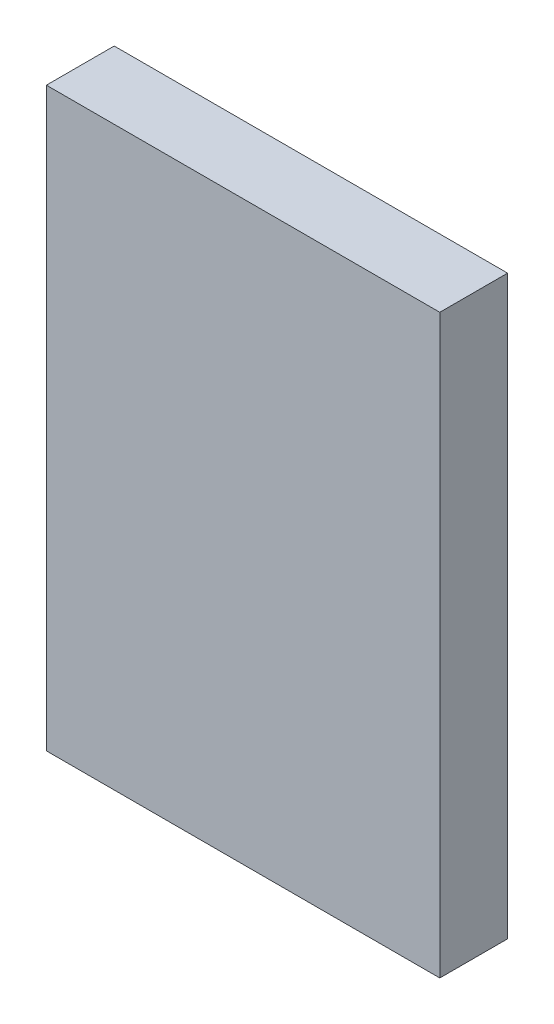
ISO-10303-21;
HEADER;
FILE_DESCRIPTION(('STEP AP214'),'2;1');
FILE_NAME('part.step','',(''),(''),'','','');
FILE_SCHEMA(('AUTOMOTIVE_DESIGN { 1 0 10303 214 1 1 1 1 }'));
ENDSEC;
DATA;
#1=APPLICATION_CONTEXT('core data for automotive mechanical design processes');
#2=APPLICATION_PROTOCOL_DEFINITION('international standard','automotive_design',2000,#1);
#3=PRODUCT_CONTEXT('',#1,'mechanical');
#4=PRODUCT('Part','Part','',(#3));
#5=PRODUCT_RELATED_PRODUCT_CATEGORY('part','',(#4));
#6=PRODUCT_DEFINITION_FORMATION('','',#4);
#7=PRODUCT_DEFINITION_CONTEXT('part definition',#1,'design');
#8=PRODUCT_DEFINITION('design','',#6,#7);
#9=PRODUCT_DEFINITION_SHAPE('','',#8);
#10=(LENGTH_UNIT() NAMED_UNIT(*) SI_UNIT(.MILLI.,.METRE.));
#11=(NAMED_UNIT(*) PLANE_ANGLE_UNIT() SI_UNIT($,.RADIAN.));
#12=(NAMED_UNIT(*) SI_UNIT($,.STERADIAN.) SOLID_ANGLE_UNIT());
#13=UNCERTAINTY_MEASURE_WITH_UNIT(LENGTH_MEASURE(1.E-05),#10,'distance_accuracy_value','');
#14=(GEOMETRIC_REPRESENTATION_CONTEXT(3) GLOBAL_UNCERTAINTY_ASSIGNED_CONTEXT((#13)) GLOBAL_UNIT_ASSIGNED_CONTEXT((#10,
#11,#12)) REPRESENTATION_CONTEXT('',''));
#15=CARTESIAN_POINT('',(0.,0.,0.));
#16=DIRECTION('',(0.,0.,1.));
#17=DIRECTION('',(1.,0.,0.));
#18=AXIS2_PLACEMENT_3D('',#15,#16,#17);
#19=CARTESIAN_POINT('',(29.,-42.5,10.));
#20=DIRECTION('',(-1.,0.,0.));
#21=DIRECTION('',(0.,0.,1.));
#22=AXIS2_PLACEMENT_3D('',#19,#20,#21);
#23=PLANE('',#22);
#24=DIRECTION('',(0.,1.,0.));
#25=VECTOR('',#24,1.);
#26=CARTESIAN_POINT('',(29.,-42.5,0.));
#27=LINE('',#26,#25);
#28=CARTESIAN_POINT('',(29.,-42.5,0.));
#29=VERTEX_POINT('',#28);
#30=CARTESIAN_POINT('',(29.,42.5,0.));
#31=VERTEX_POINT('',#30);
#32=EDGE_CURVE('E100',#29,#31,#27,.T.);
#33=ORIENTED_EDGE('',*,*,#32,.T.);
#34=DIRECTION('',(0.,0.,-1.));
#35=VECTOR('',#34,1.);
#36=CARTESIAN_POINT('',(29.,42.5,10.));
#37=LINE('',#36,#35);
#38=CARTESIAN_POINT('',(29.,42.5,10.));
#39=VERTEX_POINT('',#38);
#40=EDGE_CURVE('E11',#39,#31,#37,.T.);
#41=ORIENTED_EDGE('',*,*,#40,.F.);
#42=DIRECTION('',(0.,1.,0.));
#43=VECTOR('',#42,1.);
#44=CARTESIAN_POINT('',(29.,-42.5,10.));
#45=LINE('',#44,#43);
#46=CARTESIAN_POINT('',(29.,-42.5,10.));
#47=VERTEX_POINT('',#46);
#48=EDGE_CURVE('E88',#47,#39,#45,.T.);
#49=ORIENTED_EDGE('',*,*,#48,.F.);
#50=DIRECTION('',(0.,0.,-1.));
#51=VECTOR('',#50,1.);
#52=CARTESIAN_POINT('',(29.,-42.5,10.));
#53=LINE('',#52,#51);
#54=EDGE_CURVE('E96',#47,#29,#53,.T.);
#55=ORIENTED_EDGE('',*,*,#54,.T.);
#56=EDGE_LOOP('',(#33,#41,#49,#55));
#57=FACE_BOUND('',#56,.T.);
#58=ADVANCED_FACE('F37',(#57),#23,.F.);
#59=CARTESIAN_POINT('',(-29.,42.5,10.));
#60=DIRECTION('',(0.,-1.,0.));
#61=DIRECTION('',(0.,0.,-1.));
#62=AXIS2_PLACEMENT_3D('',#59,#60,#61);
#63=PLANE('',#62);
#64=DIRECTION('',(-1.,0.,0.));
#65=VECTOR('',#64,1.);
#66=CARTESIAN_POINT('',(-29.,42.5,0.));
#67=LINE('',#66,#65);
#68=CARTESIAN_POINT('',(-29.,42.5,0.));
#69=VERTEX_POINT('',#68);
#70=EDGE_CURVE('E92',#31,#69,#67,.T.);
#71=ORIENTED_EDGE('',*,*,#70,.T.);
#72=DIRECTION('',(0.,0.,-1.));
#73=VECTOR('',#72,1.);
#74=CARTESIAN_POINT('',(-29.,42.5,10.));
#75=LINE('',#74,#73);
#76=CARTESIAN_POINT('',(-29.,42.5,10.));
#77=VERTEX_POINT('',#76);
#78=EDGE_CURVE('E45',#77,#69,#75,.T.);
#79=ORIENTED_EDGE('',*,*,#78,.F.);
#80=DIRECTION('',(-1.,0.,0.));
#81=VECTOR('',#80,1.);
#82=CARTESIAN_POINT('',(-29.,42.5,10.));
#83=LINE('',#82,#81);
#84=EDGE_CURVE('E83',#39,#77,#83,.T.);
#85=ORIENTED_EDGE('',*,*,#84,.F.);
#86=ORIENTED_EDGE('',*,*,#40,.T.);
#87=EDGE_LOOP('',(#71,#79,#85,#86));
#88=FACE_BOUND('',#87,.T.);
#89=ADVANCED_FACE('F91',(#88),#63,.F.);
#90=CARTESIAN_POINT('',(-29.,-42.5,10.));
#91=DIRECTION('',(1.,0.,0.));
#92=DIRECTION('',(0.,0.,-1.));
#93=AXIS2_PLACEMENT_3D('',#90,#91,#92);
#94=PLANE('',#93);
#95=DIRECTION('',(0.,-1.,0.));
#96=VECTOR('',#95,1.);
#97=CARTESIAN_POINT('',(-29.,-42.5,0.));
#98=LINE('',#97,#96);
#99=CARTESIAN_POINT('',(-29.,-42.5,0.));
#100=VERTEX_POINT('',#99);
#101=EDGE_CURVE('E70',#69,#100,#98,.T.);
#102=ORIENTED_EDGE('',*,*,#101,.T.);
#103=DIRECTION('',(0.,0.,-1.));
#104=VECTOR('',#103,1.);
#105=CARTESIAN_POINT('',(-29.,-42.5,10.));
#106=LINE('',#105,#104);
#107=CARTESIAN_POINT('',(-29.,-42.5,10.));
#108=VERTEX_POINT('',#107);
#109=EDGE_CURVE('E93',#108,#100,#106,.T.);
#110=ORIENTED_EDGE('',*,*,#109,.F.);
#111=DIRECTION('',(0.,-1.,0.));
#112=VECTOR('',#111,1.);
#113=CARTESIAN_POINT('',(-29.,-42.5,10.));
#114=LINE('',#113,#112);
#115=EDGE_CURVE('E86',#77,#108,#114,.T.);
#116=ORIENTED_EDGE('',*,*,#115,.F.);
#117=ORIENTED_EDGE('',*,*,#78,.T.);
#118=EDGE_LOOP('',(#102,#110,#116,#117));
#119=FACE_BOUND('',#118,.T.);
#120=ADVANCED_FACE('F94',(#119),#94,.F.);
#121=CARTESIAN_POINT('',(-29.,-42.5,10.));
#122=DIRECTION('',(0.,1.,0.));
#123=DIRECTION('',(0.,0.,1.));
#124=AXIS2_PLACEMENT_3D('',#121,#122,#123);
#125=PLANE('',#124);
#126=DIRECTION('',(1.,0.,0.));
#127=VECTOR('',#126,1.);
#128=CARTESIAN_POINT('',(-29.,-42.5,0.));
#129=LINE('',#128,#127);
#130=EDGE_CURVE('E76',#100,#29,#129,.T.);
#131=ORIENTED_EDGE('',*,*,#130,.T.);
#132=ORIENTED_EDGE('',*,*,#54,.F.);
#133=DIRECTION('',(1.,0.,0.));
#134=VECTOR('',#133,1.);
#135=CARTESIAN_POINT('',(-29.,-42.5,10.));
#136=LINE('',#135,#134);
#137=EDGE_CURVE('E53',#108,#47,#136,.T.);
#138=ORIENTED_EDGE('',*,*,#137,.F.);
#139=ORIENTED_EDGE('',*,*,#109,.T.);
#140=EDGE_LOOP('',(#131,#132,#138,#139));
#141=FACE_BOUND('',#140,.T.);
#142=ADVANCED_FACE('F107',(#141),#125,.F.);
#143=CARTESIAN_POINT('',(0.,0.,10.));
#144=DIRECTION('',(0.,0.,-1.));
#145=DIRECTION('',(-1.,0.,0.));
#146=AXIS2_PLACEMENT_3D('',#143,#144,#145);
#147=PLANE('',#146);
#148=ORIENTED_EDGE('',*,*,#48,.T.);
#149=ORIENTED_EDGE('',*,*,#84,.T.);
#150=ORIENTED_EDGE('',*,*,#115,.T.);
#151=ORIENTED_EDGE('',*,*,#137,.T.);
#152=EDGE_LOOP('',(#148,#149,#150,#151));
#153=FACE_BOUND('',#152,.T.);
#154=ADVANCED_FACE('F84',(#153),#147,.F.);
#155=CARTESIAN_POINT('',(0.,0.,0.));
#156=DIRECTION('',(0.,0.,-1.));
#157=DIRECTION('',(-1.,0.,0.));
#158=AXIS2_PLACEMENT_3D('',#155,#156,#157);
#159=PLANE('',#158);
#160=ORIENTED_EDGE('',*,*,#32,.F.);
#161=ORIENTED_EDGE('',*,*,#130,.F.);
#162=ORIENTED_EDGE('',*,*,#101,.F.);
#163=ORIENTED_EDGE('',*,*,#70,.F.);
#164=EDGE_LOOP('',(#160,#161,#162,#163));
#165=FACE_BOUND('',#164,.T.);
#166=ADVANCED_FACE('F110',(#165),#159,.T.);
#167=CLOSED_SHELL('',(#58,#89,#120,#142,#154,#166));
#168=MANIFOLD_SOLID_BREP('B2',#167);
#169=ADVANCED_BREP_SHAPE_REPRESENTATION('',(#18,#168),#14);
#170=SHAPE_DEFINITION_REPRESENTATION(#9,#169);
ENDSEC;
END-ISO-10303-21;
